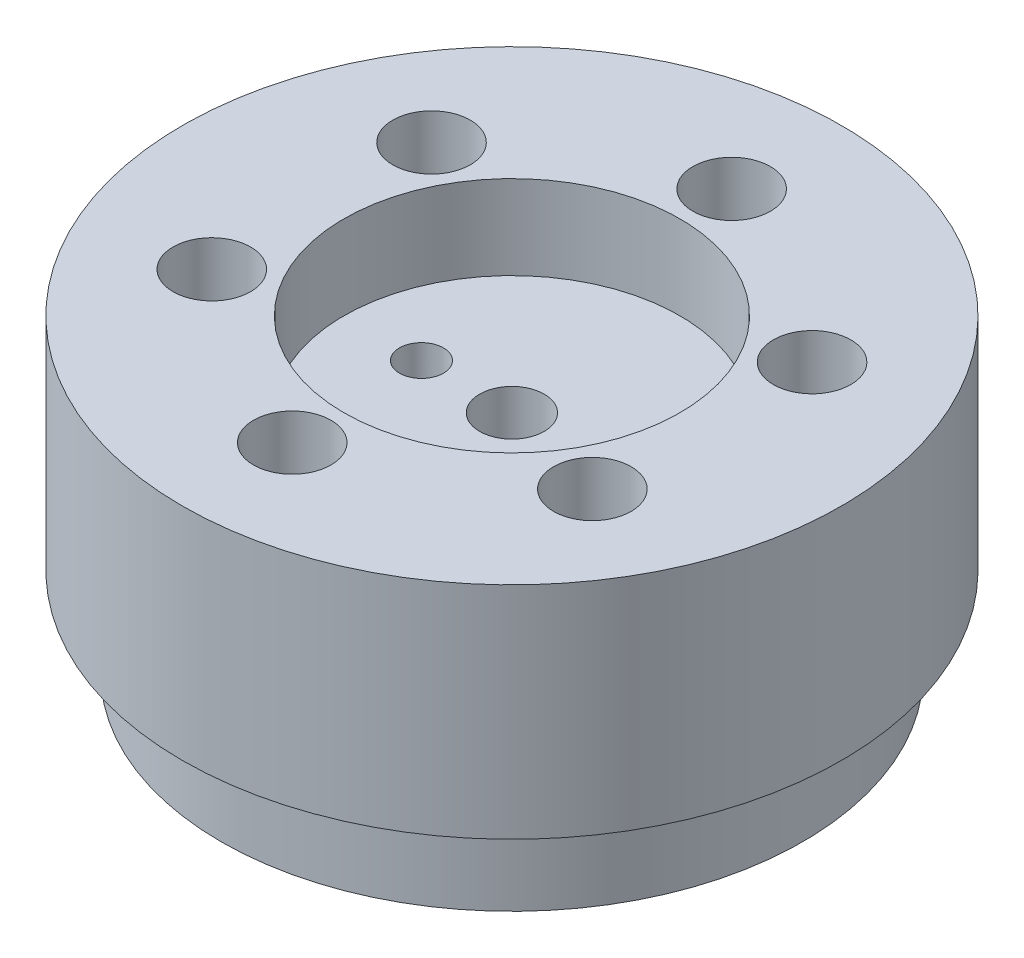
ISO-10303-21;
HEADER;
FILE_DESCRIPTION(('STEP AP214'),'2;1');
FILE_NAME('part.step','',(''),(''),'','','');
FILE_SCHEMA(('AUTOMOTIVE_DESIGN { 1 0 10303 214 1 1 1 1 }'));
ENDSEC;
DATA;
#1=APPLICATION_CONTEXT('core data for automotive mechanical design processes');
#2=APPLICATION_PROTOCOL_DEFINITION('international standard','automotive_design',2000,#1);
#3=PRODUCT_CONTEXT('',#1,'mechanical');
#4=PRODUCT('Part','Part','',(#3));
#5=PRODUCT_RELATED_PRODUCT_CATEGORY('part','',(#4));
#6=PRODUCT_DEFINITION_FORMATION('','',#4);
#7=PRODUCT_DEFINITION_CONTEXT('part definition',#1,'design');
#8=PRODUCT_DEFINITION('design','',#6,#7);
#9=PRODUCT_DEFINITION_SHAPE('','',#8);
#10=(LENGTH_UNIT() NAMED_UNIT(*) SI_UNIT(.MILLI.,.METRE.));
#11=(NAMED_UNIT(*) PLANE_ANGLE_UNIT() SI_UNIT($,.RADIAN.));
#12=(NAMED_UNIT(*) SI_UNIT($,.STERADIAN.) SOLID_ANGLE_UNIT());
#13=UNCERTAINTY_MEASURE_WITH_UNIT(LENGTH_MEASURE(1.E-05),#10,'distance_accuracy_value','');
#14=(GEOMETRIC_REPRESENTATION_CONTEXT(3) GLOBAL_UNCERTAINTY_ASSIGNED_CONTEXT((#13)) GLOBAL_UNIT_ASSIGNED_CONTEXT((#10,
#11,#12)) REPRESENTATION_CONTEXT('',''));
#15=CARTESIAN_POINT('',(0.,0.,0.));
#16=DIRECTION('',(0.,0.,1.));
#17=DIRECTION('',(1.,0.,0.));
#18=AXIS2_PLACEMENT_3D('',#15,#16,#17);
#19=CARTESIAN_POINT('',(0.,20.,0.));
#20=DIRECTION('',(0.,-1.,0.));
#21=DIRECTION('',(0.,0.,-1.));
#22=AXIS2_PLACEMENT_3D('',#19,#20,#21);
#23=CYLINDRICAL_SURFACE('',#22,22.5);
#24=CARTESIAN_POINT('',(0.,0.,0.));
#25=DIRECTION('',(0.,1.,0.));
#26=DIRECTION('',(0.,0.,1.));
#27=AXIS2_PLACEMENT_3D('',#24,#25,#26);
#28=CIRCLE('',#27,22.5);
#29=CARTESIAN_POINT('',(0.,0.,22.5));
#30=VERTEX_POINT('',#29);
#31=EDGE_CURVE('E248',#30,#30,#28,.T.);
#32=ORIENTED_EDGE('',*,*,#31,.T.);
#33=EDGE_LOOP('',(#32));
#34=FACE_BOUND('',#33,.T.);
#35=CARTESIAN_POINT('',(0.,6.95,0.));
#36=DIRECTION('',(0.,1.,0.));
#37=DIRECTION('',(0.,0.,1.));
#38=AXIS2_PLACEMENT_3D('',#35,#36,#37);
#39=CIRCLE('',#38,22.5);
#40=CARTESIAN_POINT('',(0.,6.95,22.5));
#41=VERTEX_POINT('',#40);
#42=EDGE_CURVE('E13',#41,#41,#39,.T.);
#43=ORIENTED_EDGE('',*,*,#42,.F.);
#44=EDGE_LOOP('',(#43));
#45=FACE_BOUND('',#44,.T.);
#46=ADVANCED_FACE('F73',(#34,#45),#23,.T.);
#47=CARTESIAN_POINT('',(-7.,20.,0.));
#48=DIRECTION('',(0.,-1.,0.));
#49=DIRECTION('',(0.,0.,-1.));
#50=AXIS2_PLACEMENT_3D('',#47,#48,#49);
#51=CYLINDRICAL_SURFACE('',#50,1.7);
#52=CARTESIAN_POINT('',(-7.,17.5,0.));
#53=DIRECTION('',(0.,1.,0.));
#54=DIRECTION('',(0.,0.,1.));
#55=AXIS2_PLACEMENT_3D('',#52,#53,#54);
#56=CIRCLE('',#55,1.7);
#57=CARTESIAN_POINT('',(-7.,17.5,1.7));
#58=VERTEX_POINT('',#57);
#59=EDGE_CURVE('E210',#58,#58,#56,.T.);
#60=ORIENTED_EDGE('',*,*,#59,.T.);
#61=EDGE_LOOP('',(#60));
#62=FACE_BOUND('',#61,.T.);
#63=CARTESIAN_POINT('',(-7.,9.,0.));
#64=DIRECTION('',(0.,-1.,0.));
#65=DIRECTION('',(0.,0.,-1.));
#66=AXIS2_PLACEMENT_3D('',#63,#64,#65);
#67=CIRCLE('',#66,1.7);
#68=CARTESIAN_POINT('',(-7.,9.,-1.7));
#69=VERTEX_POINT('',#68);
#70=EDGE_CURVE('E326',#69,#69,#67,.T.);
#71=ORIENTED_EDGE('',*,*,#70,.T.);
#72=EDGE_LOOP('',(#71));
#73=FACE_BOUND('',#72,.T.);
#74=ADVANCED_FACE('F378',(#62,#73),#51,.F.);
#75=CARTESIAN_POINT('',(7.,20.,0.));
#76=DIRECTION('',(0.,-1.,0.));
#77=DIRECTION('',(0.,0.,-1.));
#78=AXIS2_PLACEMENT_3D('',#75,#76,#77);
#79=CYLINDRICAL_SURFACE('',#78,1.7);
#80=CARTESIAN_POINT('',(7.,17.5,0.));
#81=DIRECTION('',(0.,1.,0.));
#82=DIRECTION('',(0.,0.,1.));
#83=AXIS2_PLACEMENT_3D('',#80,#81,#82);
#84=CIRCLE('',#83,1.7);
#85=CARTESIAN_POINT('',(7.,17.5,1.7));
#86=VERTEX_POINT('',#85);
#87=EDGE_CURVE('E209',#86,#86,#84,.T.);
#88=ORIENTED_EDGE('',*,*,#87,.T.);
#89=EDGE_LOOP('',(#88));
#90=FACE_BOUND('',#89,.T.);
#91=CARTESIAN_POINT('',(7.,9.,0.));
#92=DIRECTION('',(0.,-1.,0.));
#93=DIRECTION('',(0.,0.,-1.));
#94=AXIS2_PLACEMENT_3D('',#91,#92,#93);
#95=CIRCLE('',#94,1.7);
#96=CARTESIAN_POINT('',(7.,9.,-1.7));
#97=VERTEX_POINT('',#96);
#98=EDGE_CURVE('E320',#97,#97,#95,.T.);
#99=ORIENTED_EDGE('',*,*,#98,.T.);
#100=EDGE_LOOP('',(#99));
#101=FACE_BOUND('',#100,.T.);
#102=ADVANCED_FACE('F386',(#90,#101),#79,.F.);
#103=CARTESIAN_POINT('',(0.,15.,6.42351922616295));
#104=DIRECTION('',(0.,0.,-1.));
#105=DIRECTION('',(-1.,0.,0.));
#106=AXIS2_PLACEMENT_3D('',#103,#104,#105);
#107=PLANE('',#106);
#108=DIRECTION('',(0.,-1.,0.));
#109=VECTOR('',#108,1.);
#110=CARTESIAN_POINT('',(-8.30214142324873,15.,6.42351922616295));
#111=LINE('',#110,#109);
#112=CARTESIAN_POINT('',(-8.30214142324873,0.,6.42351922616295));
#113=VERTEX_POINT('',#112);
#114=CARTESIAN_POINT('',(-8.30214142324873,5.,6.42351922616295));
#115=VERTEX_POINT('',#114);
#116=EDGE_CURVE('E251',#113,#115,#111,.F.);
#117=ORIENTED_EDGE('',*,*,#116,.T.);
#118=DIRECTION('',(-1.,0.,0.));
#119=VECTOR('',#118,1.);
#120=CARTESIAN_POINT('',(8.30214142324873,5.,6.42351922616295));
#121=LINE('',#120,#119);
#122=CARTESIAN_POINT('',(8.30214142324873,5.,6.42351922616295));
#123=VERTEX_POINT('',#122);
#124=EDGE_CURVE('E88',#123,#115,#121,.T.);
#125=ORIENTED_EDGE('',*,*,#124,.F.);
#126=DIRECTION('',(0.,-1.,0.));
#127=VECTOR('',#126,1.);
#128=CARTESIAN_POINT('',(8.30214142324873,0.,6.42351922616295));
#129=LINE('',#128,#127);
#130=CARTESIAN_POINT('',(8.30214142324873,0.,6.42351922616295));
#131=VERTEX_POINT('',#130);
#132=EDGE_CURVE('E150',#123,#131,#129,.T.);
#133=ORIENTED_EDGE('',*,*,#132,.T.);
#134=DIRECTION('',(1.,0.,0.));
#135=VECTOR('',#134,1.);
#136=CARTESIAN_POINT('',(0.,0.,6.42351922616295));
#137=LINE('',#136,#135);
#138=EDGE_CURVE('E220',#113,#131,#137,.T.);
#139=ORIENTED_EDGE('',*,*,#138,.F.);
#140=EDGE_LOOP('',(#117,#125,#133,#139));
#141=FACE_BOUND('',#140,.T.);
#142=ADVANCED_FACE('F375',(#141),#107,.T.);
#143=CARTESIAN_POINT('',(11.3021414232487,15.,0.));
#144=DIRECTION('',(-1.,0.,0.));
#145=DIRECTION('',(0.,0.,1.));
#146=AXIS2_PLACEMENT_3D('',#143,#144,#145);
#147=PLANE('',#146);
#148=DIRECTION('',(0.,-1.,0.));
#149=VECTOR('',#148,1.);
#150=CARTESIAN_POINT('',(11.3021414232487,15.,3.42351922616295));
#151=LINE('',#150,#149);
#152=CARTESIAN_POINT('',(11.3021414232487,0.,3.42351922616295));
#153=VERTEX_POINT('',#152);
#154=CARTESIAN_POINT('',(11.3021414232487,5.,3.42351922616295));
#155=VERTEX_POINT('',#154);
#156=EDGE_CURVE('E149',#153,#155,#151,.F.);
#157=ORIENTED_EDGE('',*,*,#156,.T.);
#158=DIRECTION('',(0.,0.,1.));
#159=VECTOR('',#158,1.);
#160=CARTESIAN_POINT('',(11.3021414232487,5.,3.42351922616295));
#161=LINE('',#160,#159);
#162=CARTESIAN_POINT('',(11.3021414232487,5.,-3.42351922616295));
#163=VERTEX_POINT('',#162);
#164=EDGE_CURVE('E153',#163,#155,#161,.T.);
#165=ORIENTED_EDGE('',*,*,#164,.F.);
#166=DIRECTION('',(0.,-1.,0.));
#167=VECTOR('',#166,1.);
#168=CARTESIAN_POINT('',(11.3021414232487,15.,-3.42351922616295));
#169=LINE('',#168,#167);
#170=CARTESIAN_POINT('',(11.3021414232487,0.,-3.42351922616295));
#171=VERTEX_POINT('',#170);
#172=EDGE_CURVE('E139',#163,#171,#169,.T.);
#173=ORIENTED_EDGE('',*,*,#172,.T.);
#174=DIRECTION('',(0.,0.,-1.));
#175=VECTOR('',#174,1.);
#176=CARTESIAN_POINT('',(11.3021414232487,0.,0.));
#177=LINE('',#176,#175);
#178=EDGE_CURVE('E225',#153,#171,#177,.T.);
#179=ORIENTED_EDGE('',*,*,#178,.F.);
#180=EDGE_LOOP('',(#157,#165,#173,#179));
#181=FACE_BOUND('',#180,.T.);
#182=ADVANCED_FACE('F154',(#181),#147,.T.);
#183=CARTESIAN_POINT('',(0.,15.,-6.42351922616295));
#184=DIRECTION('',(0.,0.,-1.));
#185=DIRECTION('',(-1.,0.,0.));
#186=AXIS2_PLACEMENT_3D('',#183,#184,#185);
#187=PLANE('',#186);
#188=DIRECTION('',(1.,0.,0.));
#189=VECTOR('',#188,1.);
#190=CARTESIAN_POINT('',(8.30214142324876,5.,-6.42351922616295));
#191=LINE('',#190,#189);
#192=CARTESIAN_POINT('',(-8.30214142324873,5.,-6.42351922616295));
#193=VERTEX_POINT('',#192);
#194=CARTESIAN_POINT('',(8.30214142324873,5.,-6.42351922616295));
#195=VERTEX_POINT('',#194);
#196=EDGE_CURVE('E162',#193,#195,#191,.T.);
#197=ORIENTED_EDGE('',*,*,#196,.F.);
#198=DIRECTION('',(0.,-1.,0.));
#199=VECTOR('',#198,1.);
#200=CARTESIAN_POINT('',(-8.30214142324873,0.,-6.42351922616295));
#201=LINE('',#200,#199);
#202=CARTESIAN_POINT('',(-8.30214142324873,0.,-6.42351922616295));
#203=VERTEX_POINT('',#202);
#204=EDGE_CURVE('E262',#193,#203,#201,.T.);
#205=ORIENTED_EDGE('',*,*,#204,.T.);
#206=DIRECTION('',(1.,0.,0.));
#207=VECTOR('',#206,1.);
#208=CARTESIAN_POINT('',(0.,0.,-6.42351922616295));
#209=LINE('',#208,#207);
#210=CARTESIAN_POINT('',(8.30214142324873,0.,-6.42351922616295));
#211=VERTEX_POINT('',#210);
#212=EDGE_CURVE('E227',#203,#211,#209,.T.);
#213=ORIENTED_EDGE('',*,*,#212,.T.);
#214=DIRECTION('',(0.,-1.,0.));
#215=VECTOR('',#214,1.);
#216=CARTESIAN_POINT('',(8.30214142324873,15.,-6.42351922616295));
#217=LINE('',#216,#215);
#218=EDGE_CURVE('E260',#211,#195,#217,.F.);
#219=ORIENTED_EDGE('',*,*,#218,.T.);
#220=EDGE_LOOP('',(#197,#205,#213,#219));
#221=FACE_BOUND('',#220,.T.);
#222=ADVANCED_FACE('F366',(#221),#187,.F.);
#223=CARTESIAN_POINT('',(-11.3021414232487,15.,0.));
#224=DIRECTION('',(-1.,0.,0.));
#225=DIRECTION('',(0.,0.,1.));
#226=AXIS2_PLACEMENT_3D('',#223,#224,#225);
#227=PLANE('',#226);
#228=DIRECTION('',(0.,0.,-1.));
#229=VECTOR('',#228,1.);
#230=CARTESIAN_POINT('',(-11.3021414232487,5.,-3.42351922616297));
#231=LINE('',#230,#229);
#232=CARTESIAN_POINT('',(-11.3021414232487,5.,3.42351922616295));
#233=VERTEX_POINT('',#232);
#234=CARTESIAN_POINT('',(-11.3021414232487,5.,-3.42351922616295));
#235=VERTEX_POINT('',#234);
#236=EDGE_CURVE('E348',#233,#235,#231,.T.);
#237=ORIENTED_EDGE('',*,*,#236,.F.);
#238=DIRECTION('',(0.,-1.,0.));
#239=VECTOR('',#238,1.);
#240=CARTESIAN_POINT('',(-11.3021414232487,15.,3.42351922616295));
#241=LINE('',#240,#239);
#242=CARTESIAN_POINT('',(-11.3021414232487,0.,3.42351922616295));
#243=VERTEX_POINT('',#242);
#244=EDGE_CURVE('E258',#233,#243,#241,.T.);
#245=ORIENTED_EDGE('',*,*,#244,.T.);
#246=DIRECTION('',(0.,0.,-1.));
#247=VECTOR('',#246,1.);
#248=CARTESIAN_POINT('',(-11.3021414232487,0.,0.));
#249=LINE('',#248,#247);
#250=CARTESIAN_POINT('',(-11.3021414232487,0.,-3.42351922616295));
#251=VERTEX_POINT('',#250);
#252=EDGE_CURVE('E230',#243,#251,#249,.T.);
#253=ORIENTED_EDGE('',*,*,#252,.T.);
#254=DIRECTION('',(0.,-1.,0.));
#255=VECTOR('',#254,1.);
#256=CARTESIAN_POINT('',(-11.3021414232487,15.,-3.42351922616295));
#257=LINE('',#256,#255);
#258=EDGE_CURVE('E255',#251,#235,#257,.F.);
#259=ORIENTED_EDGE('',*,*,#258,.T.);
#260=EDGE_LOOP('',(#237,#245,#253,#259));
#261=FACE_BOUND('',#260,.T.);
#262=ADVANCED_FACE('F356',(#261),#227,.F.);
#263=CARTESIAN_POINT('',(8.30214142324873,15.,3.42351922616295));
#264=DIRECTION('',(0.,1.,0.));
#265=DIRECTION('',(0.,0.,1.));
#266=AXIS2_PLACEMENT_3D('',#263,#264,#265);
#267=CYLINDRICAL_SURFACE('',#266,3.);
#268=CARTESIAN_POINT('',(8.30214142324873,5.,3.42351922616294));
#269=DIRECTION('',(0.,-1.,0.));
#270=DIRECTION('',(0.,0.,1.));
#271=AXIS2_PLACEMENT_3D('',#268,#269,#270);
#272=CIRCLE('',#271,3.00000000000001);
#273=EDGE_CURVE('E95',#155,#123,#272,.T.);
#274=ORIENTED_EDGE('',*,*,#273,.F.);
#275=ORIENTED_EDGE('',*,*,#156,.F.);
#276=CARTESIAN_POINT('',(8.30214142324873,0.,3.42351922616295));
#277=DIRECTION('',(0.,1.,0.));
#278=DIRECTION('',(0.,0.,1.));
#279=AXIS2_PLACEMENT_3D('',#276,#277,#278);
#280=CIRCLE('',#279,3.);
#281=EDGE_CURVE('E264',#131,#153,#280,.T.);
#282=ORIENTED_EDGE('',*,*,#281,.F.);
#283=ORIENTED_EDGE('',*,*,#132,.F.);
#284=EDGE_LOOP('',(#274,#275,#282,#283));
#285=FACE_BOUND('',#284,.T.);
#286=ADVANCED_FACE('F373',(#285),#267,.F.);
#287=CARTESIAN_POINT('',(-8.30214142324873,15.,3.42351922616295));
#288=DIRECTION('',(0.,-1.,0.));
#289=DIRECTION('',(0.,0.,-1.));
#290=AXIS2_PLACEMENT_3D('',#287,#288,#289);
#291=CYLINDRICAL_SURFACE('',#290,3.);
#292=CARTESIAN_POINT('',(-8.30214142324872,5.,3.42351922616295));
#293=DIRECTION('',(0.,-1.,0.));
#294=DIRECTION('',(0.,0.,-1.));
#295=AXIS2_PLACEMENT_3D('',#292,#293,#294);
#296=CIRCLE('',#295,3.00000000000001);
#297=EDGE_CURVE('E345',#115,#233,#296,.T.);
#298=ORIENTED_EDGE('',*,*,#297,.F.);
#299=ORIENTED_EDGE('',*,*,#116,.F.);
#300=CARTESIAN_POINT('',(-8.30214142324873,0.,3.42351922616295));
#301=DIRECTION('',(0.,1.,0.));
#302=DIRECTION('',(0.,0.,1.));
#303=AXIS2_PLACEMENT_3D('',#300,#301,#302);
#304=CIRCLE('',#303,3.);
#305=EDGE_CURVE('E266',#243,#113,#304,.T.);
#306=ORIENTED_EDGE('',*,*,#305,.F.);
#307=ORIENTED_EDGE('',*,*,#244,.F.);
#308=EDGE_LOOP('',(#298,#299,#306,#307));
#309=FACE_BOUND('',#308,.T.);
#310=ADVANCED_FACE('F406',(#309),#291,.F.);
#311=CARTESIAN_POINT('',(-8.30214142324873,15.,-3.42351922616295));
#312=DIRECTION('',(0.,1.,0.));
#313=DIRECTION('',(0.,0.,1.));
#314=AXIS2_PLACEMENT_3D('',#311,#312,#313);
#315=CYLINDRICAL_SURFACE('',#314,3.);
#316=CARTESIAN_POINT('',(-8.30214142324873,5.,-3.42351922616295));
#317=DIRECTION('',(0.,-1.,0.));
#318=DIRECTION('',(0.,0.,-1.));
#319=AXIS2_PLACEMENT_3D('',#316,#317,#318);
#320=CIRCLE('',#319,3.00000000000001);
#321=EDGE_CURVE('E164',#235,#193,#320,.T.);
#322=ORIENTED_EDGE('',*,*,#321,.F.);
#323=ORIENTED_EDGE('',*,*,#258,.F.);
#324=CARTESIAN_POINT('',(-8.30214142324873,0.,-3.42351922616295));
#325=DIRECTION('',(0.,1.,0.));
#326=DIRECTION('',(0.,0.,1.));
#327=AXIS2_PLACEMENT_3D('',#324,#325,#326);
#328=CIRCLE('',#327,3.);
#329=EDGE_CURVE('E268',#203,#251,#328,.T.);
#330=ORIENTED_EDGE('',*,*,#329,.F.);
#331=ORIENTED_EDGE('',*,*,#204,.F.);
#332=EDGE_LOOP('',(#322,#323,#330,#331));
#333=FACE_BOUND('',#332,.T.);
#334=ADVANCED_FACE('F353',(#333),#315,.F.);
#335=CARTESIAN_POINT('',(8.30214142324873,15.,-3.42351922616295));
#336=DIRECTION('',(0.,-1.,0.));
#337=DIRECTION('',(0.,0.,-1.));
#338=AXIS2_PLACEMENT_3D('',#335,#336,#337);
#339=CYLINDRICAL_SURFACE('',#338,3.);
#340=CARTESIAN_POINT('',(8.30214142324873,5.,-3.42351922616295));
#341=DIRECTION('',(0.,-1.,0.));
#342=DIRECTION('',(0.,0.,1.));
#343=AXIS2_PLACEMENT_3D('',#340,#341,#342);
#344=CIRCLE('',#343,3.00000000000001);
#345=EDGE_CURVE('E143',#195,#163,#344,.T.);
#346=ORIENTED_EDGE('',*,*,#345,.F.);
#347=ORIENTED_EDGE('',*,*,#218,.F.);
#348=CARTESIAN_POINT('',(8.30214142324873,0.,-3.42351922616295));
#349=DIRECTION('',(0.,1.,0.));
#350=DIRECTION('',(0.,0.,1.));
#351=AXIS2_PLACEMENT_3D('',#348,#349,#350);
#352=CIRCLE('',#351,3.);
#353=EDGE_CURVE('E145',#171,#211,#352,.T.);
#354=ORIENTED_EDGE('',*,*,#353,.F.);
#355=ORIENTED_EDGE('',*,*,#172,.F.);
#356=EDGE_LOOP('',(#346,#347,#354,#355));
#357=FACE_BOUND('',#356,.T.);
#358=ADVANCED_FACE('F75',(#357),#339,.F.);
#359=CARTESIAN_POINT('',(0.,20.,0.));
#360=DIRECTION('',(0.,-1.,0.));
#361=DIRECTION('',(0.,0.,-1.));
#362=AXIS2_PLACEMENT_3D('',#359,#360,#361);
#363=CYLINDRICAL_SURFACE('',#362,2.5);
#364=CARTESIAN_POINT('',(0.,17.5,0.));
#365=DIRECTION('',(0.,1.,0.));
#366=DIRECTION('',(0.,0.,1.));
#367=AXIS2_PLACEMENT_3D('',#364,#365,#366);
#368=CIRCLE('',#367,2.5);
#369=CARTESIAN_POINT('',(0.,17.5,2.5));
#370=VERTEX_POINT('',#369);
#371=EDGE_CURVE('E213',#370,#370,#368,.T.);
#372=ORIENTED_EDGE('',*,*,#371,.T.);
#373=EDGE_LOOP('',(#372));
#374=FACE_BOUND('',#373,.T.);
#375=CARTESIAN_POINT('',(0.,5.,0.));
#376=DIRECTION('',(0.,-1.,0.));
#377=DIRECTION('',(0.,0.,-1.));
#378=AXIS2_PLACEMENT_3D('',#375,#376,#377);
#379=CIRCLE('',#378,2.5);
#380=CARTESIAN_POINT('',(0.,5.,-2.5));
#381=VERTEX_POINT('',#380);
#382=EDGE_CURVE('E334',#381,#381,#379,.T.);
#383=ORIENTED_EDGE('',*,*,#382,.T.);
#384=EDGE_LOOP('',(#383));
#385=FACE_BOUND('',#384,.T.);
#386=ADVANCED_FACE('F413',(#374,#385),#363,.F.);
#387=CARTESIAN_POINT('',(0.,0.,0.));
#388=DIRECTION('',(0.,1.,0.));
#389=DIRECTION('',(0.,0.,1.));
#390=AXIS2_PLACEMENT_3D('',#387,#388,#389);
#391=PLANE('',#390);
#392=ORIENTED_EDGE('',*,*,#31,.F.);
#393=EDGE_LOOP('',(#392));
#394=FACE_BOUND('',#393,.T.);
#395=ORIENTED_EDGE('',*,*,#252,.F.);
#396=ORIENTED_EDGE('',*,*,#305,.T.);
#397=ORIENTED_EDGE('',*,*,#138,.T.);
#398=ORIENTED_EDGE('',*,*,#281,.T.);
#399=ORIENTED_EDGE('',*,*,#178,.T.);
#400=ORIENTED_EDGE('',*,*,#353,.T.);
#401=ORIENTED_EDGE('',*,*,#212,.F.);
#402=ORIENTED_EDGE('',*,*,#329,.T.);
#403=EDGE_LOOP('',(#395,#396,#397,#398,#399,#400,#401,#402));
#404=FACE_BOUND('',#403,.T.);
#405=CARTESIAN_POINT('',(-14.7224318643355,0.,8.49999999999986));
#406=DIRECTION('',(0.,1.,0.));
#407=DIRECTION('',(0.,0.,1.));
#408=AXIS2_PLACEMENT_3D('',#405,#406,#407);
#409=CIRCLE('',#408,1.7);
#410=CARTESIAN_POINT('',(-14.7224318643355,0.,10.1999999999999));
#411=VERTEX_POINT('',#410);
#412=EDGE_CURVE('E203',#411,#411,#409,.T.);
#413=ORIENTED_EDGE('',*,*,#412,.T.);
#414=EDGE_LOOP('',(#413));
#415=FACE_BOUND('',#414,.T.);
#416=CARTESIAN_POINT('',(-14.7224318643354,0.,-8.50000000000014));
#417=DIRECTION('',(0.,1.,0.));
#418=DIRECTION('',(0.,0.,1.));
#419=AXIS2_PLACEMENT_3D('',#416,#417,#418);
#420=CIRCLE('',#419,1.7);
#421=CARTESIAN_POINT('',(-14.7224318643354,0.,-6.80000000000014));
#422=VERTEX_POINT('',#421);
#423=EDGE_CURVE('E200',#422,#422,#420,.T.);
#424=ORIENTED_EDGE('',*,*,#423,.T.);
#425=EDGE_LOOP('',(#424));
#426=FACE_BOUND('',#425,.T.);
#427=CARTESIAN_POINT('',(14.7224318643355,0.,-8.49999999999987));
#428=DIRECTION('',(0.,1.,0.));
#429=DIRECTION('',(0.,0.,1.));
#430=AXIS2_PLACEMENT_3D('',#427,#428,#429);
#431=CIRCLE('',#430,1.69999999999999);
#432=CARTESIAN_POINT('',(14.7224318643355,0.,-6.79999999999987));
#433=VERTEX_POINT('',#432);
#434=EDGE_CURVE('E197',#433,#433,#431,.T.);
#435=ORIENTED_EDGE('',*,*,#434,.T.);
#436=EDGE_LOOP('',(#435));
#437=FACE_BOUND('',#436,.T.);
#438=CARTESIAN_POINT('',(14.7224318643354,0.,8.50000000000013));
#439=DIRECTION('',(0.,1.,0.));
#440=DIRECTION('',(0.,0.,1.));
#441=AXIS2_PLACEMENT_3D('',#438,#439,#440);
#442=CIRCLE('',#441,1.7);
#443=CARTESIAN_POINT('',(14.7224318643354,0.,10.2000000000001));
#444=VERTEX_POINT('',#443);
#445=EDGE_CURVE('E194',#444,#444,#442,.T.);
#446=ORIENTED_EDGE('',*,*,#445,.T.);
#447=EDGE_LOOP('',(#446));
#448=FACE_BOUND('',#447,.T.);
#449=CARTESIAN_POINT('',(0.,0.,-17.));
#450=DIRECTION('',(0.,1.,0.));
#451=DIRECTION('',(0.,0.,1.));
#452=AXIS2_PLACEMENT_3D('',#449,#450,#451);
#453=CIRCLE('',#452,1.7);
#454=CARTESIAN_POINT('',(0.,0.,-15.3));
#455=VERTEX_POINT('',#454);
#456=EDGE_CURVE('E191',#455,#455,#453,.T.);
#457=ORIENTED_EDGE('',*,*,#456,.T.);
#458=EDGE_LOOP('',(#457));
#459=FACE_BOUND('',#458,.T.);
#460=CARTESIAN_POINT('',(-1.62326980651909E-13,0.,17.));
#461=DIRECTION('',(0.,1.,0.));
#462=DIRECTION('',(0.,0.,1.));
#463=AXIS2_PLACEMENT_3D('',#460,#461,#462);
#464=CIRCLE('',#463,1.7);
#465=CARTESIAN_POINT('',(-1.62326980651909E-13,0.,18.7));
#466=VERTEX_POINT('',#465);
#467=EDGE_CURVE('E188',#466,#466,#464,.T.);
#468=ORIENTED_EDGE('',*,*,#467,.T.);
#469=EDGE_LOOP('',(#468));
#470=FACE_BOUND('',#469,.T.);
#471=ADVANCED_FACE('F361',(#394,#404,#415,#426,#437,#448,#459,#470),#391,.F.);
#472=CARTESIAN_POINT('',(14.7224318643354,20.,8.50000000000013));
#473=DIRECTION('',(0.,-1.,0.));
#474=DIRECTION('',(0.,0.,-1.));
#475=AXIS2_PLACEMENT_3D('',#472,#473,#474);
#476=CYLINDRICAL_SURFACE('',#475,3.);
#477=CARTESIAN_POINT('',(14.7224318643354,12.,8.50000000000013));
#478=DIRECTION('',(0.,1.,0.));
#479=DIRECTION('',(0.,0.,1.));
#480=AXIS2_PLACEMENT_3D('',#477,#478,#479);
#481=CIRCLE('',#480,3.);
#482=CARTESIAN_POINT('',(14.7224318643354,12.,11.5000000000001));
#483=VERTEX_POINT('',#482);
#484=EDGE_CURVE('E282',#483,#483,#481,.T.);
#485=ORIENTED_EDGE('',*,*,#484,.F.);
#486=EDGE_LOOP('',(#485));
#487=FACE_BOUND('',#486,.T.);
#488=CARTESIAN_POINT('',(14.7224318643354,24.,8.50000000000013));
#489=DIRECTION('',(0.,1.,0.));
#490=DIRECTION('',(0.,0.,1.));
#491=AXIS2_PLACEMENT_3D('',#488,#489,#490);
#492=CIRCLE('',#491,3.);
#493=CARTESIAN_POINT('',(14.7224318643354,24.,11.5000000000001));
#494=VERTEX_POINT('',#493);
#495=EDGE_CURVE('E233',#494,#494,#492,.T.);
#496=ORIENTED_EDGE('',*,*,#495,.T.);
#497=EDGE_LOOP('',(#496));
#498=FACE_BOUND('',#497,.T.);
#499=ADVANCED_FACE('F399',(#487,#498),#476,.F.);
#500=CARTESIAN_POINT('',(14.7224318643355,20.,-8.49999999999987));
#501=DIRECTION('',(0.,-1.,0.));
#502=DIRECTION('',(0.,0.,-1.));
#503=AXIS2_PLACEMENT_3D('',#500,#501,#502);
#504=CYLINDRICAL_SURFACE('',#503,3.);
#505=CARTESIAN_POINT('',(14.7224318643355,12.,-8.49999999999987));
#506=DIRECTION('',(0.,1.,0.));
#507=DIRECTION('',(0.,0.,1.));
#508=AXIS2_PLACEMENT_3D('',#505,#506,#507);
#509=CIRCLE('',#508,3.);
#510=CARTESIAN_POINT('',(14.7224318643355,12.,-5.49999999999987));
#511=VERTEX_POINT('',#510);
#512=EDGE_CURVE('E279',#511,#511,#509,.T.);
#513=ORIENTED_EDGE('',*,*,#512,.F.);
#514=EDGE_LOOP('',(#513));
#515=FACE_BOUND('',#514,.T.);
#516=CARTESIAN_POINT('',(14.7224318643355,24.,-8.49999999999987));
#517=DIRECTION('',(0.,1.,0.));
#518=DIRECTION('',(0.,0.,1.));
#519=AXIS2_PLACEMENT_3D('',#516,#517,#518);
#520=CIRCLE('',#519,3.);
#521=CARTESIAN_POINT('',(14.7224318643355,24.,-5.49999999999987));
#522=VERTEX_POINT('',#521);
#523=EDGE_CURVE('E236',#522,#522,#520,.T.);
#524=ORIENTED_EDGE('',*,*,#523,.T.);
#525=EDGE_LOOP('',(#524));
#526=FACE_BOUND('',#525,.T.);
#527=ADVANCED_FACE('F395',(#515,#526),#504,.F.);
#528=CARTESIAN_POINT('',(-14.7224318643354,20.,-8.50000000000014));
#529=DIRECTION('',(0.,-1.,0.));
#530=DIRECTION('',(0.,0.,-1.));
#531=AXIS2_PLACEMENT_3D('',#528,#529,#530);
#532=CYLINDRICAL_SURFACE('',#531,3.);
#533=CARTESIAN_POINT('',(-14.7224318643354,12.,-8.50000000000014));
#534=DIRECTION('',(0.,1.,0.));
#535=DIRECTION('',(0.,0.,1.));
#536=AXIS2_PLACEMENT_3D('',#533,#534,#535);
#537=CIRCLE('',#536,3.);
#538=CARTESIAN_POINT('',(-14.7224318643354,12.,-5.50000000000014));
#539=VERTEX_POINT('',#538);
#540=EDGE_CURVE('E271',#539,#539,#537,.T.);
#541=ORIENTED_EDGE('',*,*,#540,.F.);
#542=EDGE_LOOP('',(#541));
#543=FACE_BOUND('',#542,.T.);
#544=CARTESIAN_POINT('',(-14.7224318643354,24.,-8.50000000000014));
#545=DIRECTION('',(0.,1.,0.));
#546=DIRECTION('',(0.,0.,1.));
#547=AXIS2_PLACEMENT_3D('',#544,#545,#546);
#548=CIRCLE('',#547,3.);
#549=CARTESIAN_POINT('',(-14.7224318643354,24.,-5.50000000000014));
#550=VERTEX_POINT('',#549);
#551=EDGE_CURVE('E239',#550,#550,#548,.T.);
#552=ORIENTED_EDGE('',*,*,#551,.T.);
#553=EDGE_LOOP('',(#552));
#554=FACE_BOUND('',#553,.T.);
#555=ADVANCED_FACE('F296',(#543,#554),#532,.F.);
#556=CARTESIAN_POINT('',(-14.7224318643355,20.,8.49999999999986));
#557=DIRECTION('',(0.,-1.,0.));
#558=DIRECTION('',(0.,0.,-1.));
#559=AXIS2_PLACEMENT_3D('',#556,#557,#558);
#560=CYLINDRICAL_SURFACE('',#559,3.);
#561=CARTESIAN_POINT('',(-14.7224318643355,12.,8.49999999999986));
#562=DIRECTION('',(0.,1.,0.));
#563=DIRECTION('',(0.,0.,1.));
#564=AXIS2_PLACEMENT_3D('',#561,#562,#563);
#565=CIRCLE('',#564,3.);
#566=CARTESIAN_POINT('',(-14.7224318643355,12.,11.4999999999999));
#567=VERTEX_POINT('',#566);
#568=EDGE_CURVE('E81',#567,#567,#565,.T.);
#569=ORIENTED_EDGE('',*,*,#568,.F.);
#570=EDGE_LOOP('',(#569));
#571=FACE_BOUND('',#570,.T.);
#572=CARTESIAN_POINT('',(-14.7224318643355,24.,8.49999999999986));
#573=DIRECTION('',(0.,1.,0.));
#574=DIRECTION('',(0.,0.,1.));
#575=AXIS2_PLACEMENT_3D('',#572,#573,#574);
#576=CIRCLE('',#575,3.);
#577=CARTESIAN_POINT('',(-14.7224318643355,24.,11.4999999999999));
#578=VERTEX_POINT('',#577);
#579=EDGE_CURVE('E242',#578,#578,#576,.T.);
#580=ORIENTED_EDGE('',*,*,#579,.T.);
#581=EDGE_LOOP('',(#580));
#582=FACE_BOUND('',#581,.T.);
#583=ADVANCED_FACE('F292',(#571,#582),#560,.F.);
#584=CARTESIAN_POINT('',(0.,24.,0.));
#585=DIRECTION('',(0.,-1.,0.));
#586=DIRECTION('',(0.,0.,-1.));
#587=AXIS2_PLACEMENT_3D('',#584,#585,#586);
#588=CYLINDRICAL_SURFACE('',#587,13.);
#589=CARTESIAN_POINT('',(0.,24.,0.));
#590=DIRECTION('',(0.,1.,0.));
#591=DIRECTION('',(0.,0.,1.));
#592=AXIS2_PLACEMENT_3D('',#589,#590,#591);
#593=CIRCLE('',#592,13.);
#594=CARTESIAN_POINT('',(0.,24.,13.));
#595=VERTEX_POINT('',#594);
#596=EDGE_CURVE('E245',#595,#595,#593,.T.);
#597=ORIENTED_EDGE('',*,*,#596,.T.);
#598=EDGE_LOOP('',(#597));
#599=FACE_BOUND('',#598,.T.);
#600=CARTESIAN_POINT('',(0.,17.5,0.));
#601=DIRECTION('',(0.,1.,0.));
#602=DIRECTION('',(0.,0.,1.));
#603=AXIS2_PLACEMENT_3D('',#600,#601,#602);
#604=CIRCLE('',#603,13.);
#605=CARTESIAN_POINT('',(0.,17.5,13.));
#606=VERTEX_POINT('',#605);
#607=EDGE_CURVE('E206',#606,#606,#604,.T.);
#608=ORIENTED_EDGE('',*,*,#607,.F.);
#609=EDGE_LOOP('',(#608));
#610=FACE_BOUND('',#609,.T.);
#611=ADVANCED_FACE('F295',(#599,#610),#588,.F.);
#612=CARTESIAN_POINT('',(0.,24.,0.));
#613=DIRECTION('',(0.,1.,0.));
#614=DIRECTION('',(0.,0.,1.));
#615=AXIS2_PLACEMENT_3D('',#612,#613,#614);
#616=PLANE('',#615);
#617=CARTESIAN_POINT('',(0.,24.,-17.));
#618=DIRECTION('',(0.,1.,0.));
#619=DIRECTION('',(0.,0.,1.));
#620=AXIS2_PLACEMENT_3D('',#617,#618,#619);
#621=CIRCLE('',#620,3.);
#622=CARTESIAN_POINT('',(0.,24.,-14.));
#623=VERTEX_POINT('',#622);
#624=EDGE_CURVE('E217',#623,#623,#621,.T.);
#625=ORIENTED_EDGE('',*,*,#624,.F.);
#626=EDGE_LOOP('',(#625));
#627=FACE_BOUND('',#626,.T.);
#628=CARTESIAN_POINT('',(-1.62326980651909E-13,24.,17.));
#629=DIRECTION('',(0.,1.,0.));
#630=DIRECTION('',(0.,0.,1.));
#631=AXIS2_PLACEMENT_3D('',#628,#629,#630);
#632=CIRCLE('',#631,3.);
#633=CARTESIAN_POINT('',(-1.62326980651909E-13,24.,20.));
#634=VERTEX_POINT('',#633);
#635=EDGE_CURVE('E216',#634,#634,#632,.T.);
#636=ORIENTED_EDGE('',*,*,#635,.F.);
#637=EDGE_LOOP('',(#636));
#638=FACE_BOUND('',#637,.T.);
#639=ORIENTED_EDGE('',*,*,#495,.F.);
#640=EDGE_LOOP('',(#639));
#641=FACE_BOUND('',#640,.T.);
#642=ORIENTED_EDGE('',*,*,#523,.F.);
#643=EDGE_LOOP('',(#642));
#644=FACE_BOUND('',#643,.T.);
#645=ORIENTED_EDGE('',*,*,#551,.F.);
#646=EDGE_LOOP('',(#645));
#647=FACE_BOUND('',#646,.T.);
#648=ORIENTED_EDGE('',*,*,#579,.F.);
#649=EDGE_LOOP('',(#648));
#650=FACE_BOUND('',#649,.T.);
#651=ORIENTED_EDGE('',*,*,#596,.F.);
#652=EDGE_LOOP('',(#651));
#653=FACE_BOUND('',#652,.T.);
#654=CARTESIAN_POINT('',(0.,24.,0.));
#655=DIRECTION('',(0.,1.,0.));
#656=DIRECTION('',(0.,0.,1.));
#657=AXIS2_PLACEMENT_3D('',#654,#655,#656);
#658=CIRCLE('',#657,25.5);
#659=CARTESIAN_POINT('',(0.,24.,25.5));
#660=VERTEX_POINT('',#659);
#661=EDGE_CURVE('E185',#660,#660,#658,.T.);
#662=ORIENTED_EDGE('',*,*,#661,.T.);
#663=EDGE_LOOP('',(#662));
#664=FACE_BOUND('',#663,.T.);
#665=ADVANCED_FACE('F300',(#627,#638,#641,#644,#647,#650,#653,#664),#616,.T.);
#666=CARTESIAN_POINT('',(-1.62326980651909E-13,32.4852813742386,17.));
#667=DIRECTION('',(0.,-1.,0.));
#668=DIRECTION('',(0.,0.,-1.));
#669=AXIS2_PLACEMENT_3D('',#666,#667,#668);
#670=CYLINDRICAL_SURFACE('',#669,3.);
#671=CARTESIAN_POINT('',(-1.62326980651909E-13,12.,17.));
#672=DIRECTION('',(0.,1.,0.));
#673=DIRECTION('',(0.,0.,1.));
#674=AXIS2_PLACEMENT_3D('',#671,#672,#673);
#675=CIRCLE('',#674,3.);
#676=CARTESIAN_POINT('',(-1.62326980651909E-13,12.,20.));
#677=VERTEX_POINT('',#676);
#678=EDGE_CURVE('E285',#677,#677,#675,.T.);
#679=ORIENTED_EDGE('',*,*,#678,.F.);
#680=EDGE_LOOP('',(#679));
#681=FACE_BOUND('',#680,.T.);
#682=ORIENTED_EDGE('',*,*,#635,.T.);
#683=EDGE_LOOP('',(#682));
#684=FACE_BOUND('',#683,.T.);
#685=ADVANCED_FACE('F303',(#681,#684),#670,.F.);
#686=CARTESIAN_POINT('',(0.,32.4852813742386,-17.));
#687=DIRECTION('',(0.,-1.,0.));
#688=DIRECTION('',(0.,0.,-1.));
#689=AXIS2_PLACEMENT_3D('',#686,#687,#688);
#690=CYLINDRICAL_SURFACE('',#689,3.);
#691=CARTESIAN_POINT('',(0.,12.,-17.));
#692=DIRECTION('',(0.,1.,0.));
#693=DIRECTION('',(0.,0.,1.));
#694=AXIS2_PLACEMENT_3D('',#691,#692,#693);
#695=CIRCLE('',#694,3.);
#696=CARTESIAN_POINT('',(0.,12.,-14.));
#697=VERTEX_POINT('',#696);
#698=EDGE_CURVE('E276',#697,#697,#695,.T.);
#699=ORIENTED_EDGE('',*,*,#698,.F.);
#700=EDGE_LOOP('',(#699));
#701=FACE_BOUND('',#700,.T.);
#702=ORIENTED_EDGE('',*,*,#624,.T.);
#703=EDGE_LOOP('',(#702));
#704=FACE_BOUND('',#703,.T.);
#705=ADVANCED_FACE('F438',(#701,#704),#690,.F.);
#706=CARTESIAN_POINT('',(0.,17.5,0.));
#707=DIRECTION('',(0.,1.,0.));
#708=DIRECTION('',(0.,0.,1.));
#709=AXIS2_PLACEMENT_3D('',#706,#707,#708);
#710=PLANE('',#709);
#711=ORIENTED_EDGE('',*,*,#371,.F.);
#712=EDGE_LOOP('',(#711));
#713=FACE_BOUND('',#712,.T.);
#714=ORIENTED_EDGE('',*,*,#59,.F.);
#715=EDGE_LOOP('',(#714));
#716=FACE_BOUND('',#715,.T.);
#717=ORIENTED_EDGE('',*,*,#87,.F.);
#718=EDGE_LOOP('',(#717));
#719=FACE_BOUND('',#718,.T.);
#720=ORIENTED_EDGE('',*,*,#607,.T.);
#721=EDGE_LOOP('',(#720));
#722=FACE_BOUND('',#721,.T.);
#723=ADVANCED_FACE('F435',(#713,#716,#719,#722),#710,.T.);
#724=CARTESIAN_POINT('',(-14.7224318643355,32.4852813742386,8.49999999999986));
#725=DIRECTION('',(0.,-1.,0.));
#726=DIRECTION('',(0.,0.,-1.));
#727=AXIS2_PLACEMENT_3D('',#724,#725,#726);
#728=CYLINDRICAL_SURFACE('',#727,1.7);
#729=ORIENTED_EDGE('',*,*,#412,.F.);
#730=EDGE_LOOP('',(#729));
#731=FACE_BOUND('',#730,.T.);
#732=CARTESIAN_POINT('',(-14.7224318643355,12.,8.49999999999988));
#733=DIRECTION('',(0.,1.,0.));
#734=DIRECTION('',(0.,0.,1.));
#735=AXIS2_PLACEMENT_3D('',#732,#733,#734);
#736=CIRCLE('',#735,1.7);
#737=CARTESIAN_POINT('',(-14.7224318643355,12.,10.1999999999999));
#738=VERTEX_POINT('',#737);
#739=EDGE_CURVE('E156',#738,#738,#736,.T.);
#740=ORIENTED_EDGE('',*,*,#739,.T.);
#741=EDGE_LOOP('',(#740));
#742=FACE_BOUND('',#741,.T.);
#743=ADVANCED_FACE('F437',(#731,#742),#728,.F.);
#744=CARTESIAN_POINT('',(-14.7224318643354,32.4852813742386,-8.50000000000014));
#745=DIRECTION('',(0.,-1.,0.));
#746=DIRECTION('',(0.,0.,-1.));
#747=AXIS2_PLACEMENT_3D('',#744,#745,#746);
#748=CYLINDRICAL_SURFACE('',#747,1.7);
#749=ORIENTED_EDGE('',*,*,#423,.F.);
#750=EDGE_LOOP('',(#749));
#751=FACE_BOUND('',#750,.T.);
#752=CARTESIAN_POINT('',(-14.7224318643354,12.,-8.50000000000012));
#753=DIRECTION('',(0.,1.,0.));
#754=DIRECTION('',(0.,0.,1.));
#755=AXIS2_PLACEMENT_3D('',#752,#753,#754);
#756=CIRCLE('',#755,1.7);
#757=CARTESIAN_POINT('',(-14.7224318643354,12.,-6.80000000000012));
#758=VERTEX_POINT('',#757);
#759=EDGE_CURVE('E182',#758,#758,#756,.T.);
#760=ORIENTED_EDGE('',*,*,#759,.T.);
#761=EDGE_LOOP('',(#760));
#762=FACE_BOUND('',#761,.T.);
#763=ADVANCED_FACE('F445',(#751,#762),#748,.F.);
#764=CARTESIAN_POINT('',(14.7224318643355,32.4852813742386,-8.49999999999987));
#765=DIRECTION('',(0.,-1.,0.));
#766=DIRECTION('',(0.,0.,-1.));
#767=AXIS2_PLACEMENT_3D('',#764,#765,#766);
#768=CYLINDRICAL_SURFACE('',#767,1.69999999999999);
#769=ORIENTED_EDGE('',*,*,#434,.F.);
#770=EDGE_LOOP('',(#769));
#771=FACE_BOUND('',#770,.T.);
#772=CARTESIAN_POINT('',(14.7224318643355,12.,-8.49999999999987));
#773=DIRECTION('',(0.,1.,0.));
#774=DIRECTION('',(0.,0.,1.));
#775=AXIS2_PLACEMENT_3D('',#772,#773,#774);
#776=CIRCLE('',#775,1.69999999999999);
#777=CARTESIAN_POINT('',(14.7224318643355,12.,-6.79999999999987));
#778=VERTEX_POINT('',#777);
#779=EDGE_CURVE('E176',#778,#778,#776,.F.);
#780=ORIENTED_EDGE('',*,*,#779,.F.);
#781=EDGE_LOOP('',(#780));
#782=FACE_BOUND('',#781,.T.);
#783=ADVANCED_FACE('F509',(#771,#782),#768,.F.);
#784=CARTESIAN_POINT('',(14.7224318643354,32.4852813742386,8.50000000000013));
#785=DIRECTION('',(0.,-1.,0.));
#786=DIRECTION('',(0.,0.,-1.));
#787=AXIS2_PLACEMENT_3D('',#784,#785,#786);
#788=CYLINDRICAL_SURFACE('',#787,1.7);
#789=ORIENTED_EDGE('',*,*,#445,.F.);
#790=EDGE_LOOP('',(#789));
#791=FACE_BOUND('',#790,.T.);
#792=CARTESIAN_POINT('',(14.7224318643354,12.,8.50000000000013));
#793=DIRECTION('',(0.,1.,0.));
#794=DIRECTION('',(0.,0.,1.));
#795=AXIS2_PLACEMENT_3D('',#792,#793,#794);
#796=CIRCLE('',#795,1.70000000000001);
#797=CARTESIAN_POINT('',(14.7224318643354,12.,10.2000000000001));
#798=VERTEX_POINT('',#797);
#799=EDGE_CURVE('E173',#798,#798,#796,.T.);
#800=ORIENTED_EDGE('',*,*,#799,.T.);
#801=EDGE_LOOP('',(#800));
#802=FACE_BOUND('',#801,.T.);
#803=ADVANCED_FACE('F505',(#791,#802),#788,.F.);
#804=CARTESIAN_POINT('',(0.,32.4852813742386,-17.));
#805=DIRECTION('',(0.,-1.,0.));
#806=DIRECTION('',(0.,0.,-1.));
#807=AXIS2_PLACEMENT_3D('',#804,#805,#806);
#808=CYLINDRICAL_SURFACE('',#807,1.7);
#809=ORIENTED_EDGE('',*,*,#456,.F.);
#810=EDGE_LOOP('',(#809));
#811=FACE_BOUND('',#810,.T.);
#812=CARTESIAN_POINT('',(1.37476835471162E-13,12.,-17.));
#813=DIRECTION('',(0.,1.,0.));
#814=DIRECTION('',(0.,0.,1.));
#815=AXIS2_PLACEMENT_3D('',#812,#813,#814);
#816=CIRCLE('',#815,1.7);
#817=CARTESIAN_POINT('',(1.37476835471162E-13,12.,-15.3));
#818=VERTEX_POINT('',#817);
#819=EDGE_CURVE('E179',#818,#818,#816,.T.);
#820=ORIENTED_EDGE('',*,*,#819,.T.);
#821=EDGE_LOOP('',(#820));
#822=FACE_BOUND('',#821,.T.);
#823=ADVANCED_FACE('F501',(#811,#822),#808,.F.);
#824=CARTESIAN_POINT('',(-1.62326980651909E-13,32.4852813742386,17.));
#825=DIRECTION('',(0.,-1.,0.));
#826=DIRECTION('',(0.,0.,-1.));
#827=AXIS2_PLACEMENT_3D('',#824,#825,#826);
#828=CYLINDRICAL_SURFACE('',#827,1.7);
#829=ORIENTED_EDGE('',*,*,#467,.F.);
#830=EDGE_LOOP('',(#829));
#831=FACE_BOUND('',#830,.T.);
#832=CARTESIAN_POINT('',(-1.46855184263162E-13,12.,17.));
#833=DIRECTION('',(0.,1.,0.));
#834=DIRECTION('',(0.,0.,1.));
#835=AXIS2_PLACEMENT_3D('',#832,#833,#834);
#836=CIRCLE('',#835,1.7);
#837=CARTESIAN_POINT('',(-1.46855184263162E-13,12.,18.7));
#838=VERTEX_POINT('',#837);
#839=EDGE_CURVE('E170',#838,#838,#836,.T.);
#840=ORIENTED_EDGE('',*,*,#839,.T.);
#841=EDGE_LOOP('',(#840));
#842=FACE_BOUND('',#841,.T.);
#843=ADVANCED_FACE('F314',(#831,#842),#828,.F.);
#844=CARTESIAN_POINT('',(0.,-72.1248916810278,0.));
#845=DIRECTION('',(0.,1.,0.));
#846=DIRECTION('',(0.,0.,1.));
#847=AXIS2_PLACEMENT_3D('',#844,#845,#846);
#848=CYLINDRICAL_SURFACE('',#847,25.5);
#849=ORIENTED_EDGE('',*,*,#661,.F.);
#850=EDGE_LOOP('',(#849));
#851=FACE_BOUND('',#850,.T.);
#852=CARTESIAN_POINT('',(0.,6.95,0.));
#853=DIRECTION('',(0.,1.,0.));
#854=DIRECTION('',(0.,0.,1.));
#855=AXIS2_PLACEMENT_3D('',#852,#853,#854);
#856=CIRCLE('',#855,25.5);
#857=CARTESIAN_POINT('',(0.,6.95,25.5));
#858=VERTEX_POINT('',#857);
#859=EDGE_CURVE('E318',#858,#858,#856,.T.);
#860=ORIENTED_EDGE('',*,*,#859,.T.);
#861=EDGE_LOOP('',(#860));
#862=FACE_BOUND('',#861,.T.);
#863=ADVANCED_FACE('F310',(#851,#862),#848,.T.);
#864=CARTESIAN_POINT('',(0.,12.,0.));
#865=DIRECTION('',(0.,1.,0.));
#866=DIRECTION('',(0.,0.,1.));
#867=AXIS2_PLACEMENT_3D('',#864,#865,#866);
#868=PLANE('',#867);
#869=ORIENTED_EDGE('',*,*,#540,.T.);
#870=EDGE_LOOP('',(#869));
#871=FACE_BOUND('',#870,.T.);
#872=ORIENTED_EDGE('',*,*,#759,.F.);
#873=EDGE_LOOP('',(#872));
#874=FACE_BOUND('',#873,.T.);
#875=ADVANCED_FACE('F313',(#871,#874),#868,.T.);
#876=CARTESIAN_POINT('',(0.,12.,0.));
#877=DIRECTION('',(0.,1.,0.));
#878=DIRECTION('',(0.,0.,1.));
#879=AXIS2_PLACEMENT_3D('',#876,#877,#878);
#880=PLANE('',#879);
#881=ORIENTED_EDGE('',*,*,#819,.F.);
#882=EDGE_LOOP('',(#881));
#883=FACE_BOUND('',#882,.T.);
#884=ORIENTED_EDGE('',*,*,#698,.T.);
#885=EDGE_LOOP('',(#884));
#886=FACE_BOUND('',#885,.T.);
#887=ADVANCED_FACE('F491',(#883,#886),#880,.T.);
#888=CARTESIAN_POINT('',(0.,12.,0.));
#889=DIRECTION('',(0.,1.,0.));
#890=DIRECTION('',(0.,0.,1.));
#891=AXIS2_PLACEMENT_3D('',#888,#889,#890);
#892=PLANE('',#891);
#893=ORIENTED_EDGE('',*,*,#779,.T.);
#894=EDGE_LOOP('',(#893));
#895=FACE_BOUND('',#894,.T.);
#896=ORIENTED_EDGE('',*,*,#512,.T.);
#897=EDGE_LOOP('',(#896));
#898=FACE_BOUND('',#897,.T.);
#899=ADVANCED_FACE('F483',(#895,#898),#892,.T.);
#900=CARTESIAN_POINT('',(0.,12.,0.));
#901=DIRECTION('',(0.,1.,0.));
#902=DIRECTION('',(0.,0.,1.));
#903=AXIS2_PLACEMENT_3D('',#900,#901,#902);
#904=PLANE('',#903);
#905=ORIENTED_EDGE('',*,*,#799,.F.);
#906=EDGE_LOOP('',(#905));
#907=FACE_BOUND('',#906,.T.);
#908=ORIENTED_EDGE('',*,*,#484,.T.);
#909=EDGE_LOOP('',(#908));
#910=FACE_BOUND('',#909,.T.);
#911=ADVANCED_FACE('F474',(#907,#910),#904,.T.);
#912=CARTESIAN_POINT('',(0.,12.,0.));
#913=DIRECTION('',(0.,1.,0.));
#914=DIRECTION('',(0.,0.,1.));
#915=AXIS2_PLACEMENT_3D('',#912,#913,#914);
#916=PLANE('',#915);
#917=ORIENTED_EDGE('',*,*,#839,.F.);
#918=EDGE_LOOP('',(#917));
#919=FACE_BOUND('',#918,.T.);
#920=ORIENTED_EDGE('',*,*,#678,.T.);
#921=EDGE_LOOP('',(#920));
#922=FACE_BOUND('',#921,.T.);
#923=ADVANCED_FACE('F472',(#919,#922),#916,.T.);
#924=CARTESIAN_POINT('',(0.,12.,0.));
#925=DIRECTION('',(0.,1.,0.));
#926=DIRECTION('',(0.,0.,1.));
#927=AXIS2_PLACEMENT_3D('',#924,#925,#926);
#928=PLANE('',#927);
#929=ORIENTED_EDGE('',*,*,#739,.F.);
#930=EDGE_LOOP('',(#929));
#931=FACE_BOUND('',#930,.T.);
#932=ORIENTED_EDGE('',*,*,#568,.T.);
#933=EDGE_LOOP('',(#932));
#934=FACE_BOUND('',#933,.T.);
#935=ADVANCED_FACE('F290',(#931,#934),#928,.T.);
#936=CARTESIAN_POINT('',(8.30214142324873,5.,3.42351922616294));
#937=DIRECTION('',(0.,1.,0.));
#938=DIRECTION('',(0.,0.,1.));
#939=AXIS2_PLACEMENT_3D('',#936,#937,#938);
#940=PLANE('',#939);
#941=CARTESIAN_POINT('',(-7.,5.,0.));
#942=DIRECTION('',(0.,-1.,0.));
#943=DIRECTION('',(0.,0.,-1.));
#944=AXIS2_PLACEMENT_3D('',#941,#942,#943);
#945=CIRCLE('',#944,2.5);
#946=CARTESIAN_POINT('',(-7.,5.,-2.5));
#947=VERTEX_POINT('',#946);
#948=EDGE_CURVE('E329',#947,#947,#945,.T.);
#949=ORIENTED_EDGE('',*,*,#948,.F.);
#950=EDGE_LOOP('',(#949));
#951=FACE_BOUND('',#950,.T.);
#952=CARTESIAN_POINT('',(7.,5.,0.));
#953=DIRECTION('',(0.,-1.,0.));
#954=DIRECTION('',(0.,0.,-1.));
#955=AXIS2_PLACEMENT_3D('',#952,#953,#954);
#956=CIRCLE('',#955,2.5);
#957=CARTESIAN_POINT('',(7.,5.,-2.5));
#958=VERTEX_POINT('',#957);
#959=EDGE_CURVE('E323',#958,#958,#956,.T.);
#960=ORIENTED_EDGE('',*,*,#959,.F.);
#961=EDGE_LOOP('',(#960));
#962=FACE_BOUND('',#961,.T.);
#963=ORIENTED_EDGE('',*,*,#273,.T.);
#964=ORIENTED_EDGE('',*,*,#124,.T.);
#965=ORIENTED_EDGE('',*,*,#297,.T.);
#966=ORIENTED_EDGE('',*,*,#236,.T.);
#967=ORIENTED_EDGE('',*,*,#321,.T.);
#968=ORIENTED_EDGE('',*,*,#196,.T.);
#969=ORIENTED_EDGE('',*,*,#345,.T.);
#970=ORIENTED_EDGE('',*,*,#164,.T.);
#971=EDGE_LOOP('',(#963,#964,#965,#966,#967,#968,#969,#970));
#972=FACE_BOUND('',#971,.T.);
#973=ORIENTED_EDGE('',*,*,#382,.F.);
#974=EDGE_LOOP('',(#973));
#975=FACE_BOUND('',#974,.T.);
#976=ADVANCED_FACE('F159',(#951,#962,#972,#975),#940,.F.);
#977=CARTESIAN_POINT('',(7.,9.,0.));
#978=DIRECTION('',(0.,-1.,0.));
#979=DIRECTION('',(0.,0.,-1.));
#980=AXIS2_PLACEMENT_3D('',#977,#978,#979);
#981=CYLINDRICAL_SURFACE('',#980,2.5);
#982=CARTESIAN_POINT('',(7.,9.,0.));
#983=DIRECTION('',(0.,-1.,0.));
#984=DIRECTION('',(0.,0.,-1.));
#985=AXIS2_PLACEMENT_3D('',#982,#983,#984);
#986=CIRCLE('',#985,2.5);
#987=CARTESIAN_POINT('',(7.,9.,-2.5));
#988=VERTEX_POINT('',#987);
#989=EDGE_CURVE('E330',#988,#988,#986,.T.);
#990=ORIENTED_EDGE('',*,*,#989,.F.);
#991=EDGE_LOOP('',(#990));
#992=FACE_BOUND('',#991,.T.);
#993=ORIENTED_EDGE('',*,*,#959,.T.);
#994=EDGE_LOOP('',(#993));
#995=FACE_BOUND('',#994,.T.);
#996=ADVANCED_FACE('F665',(#992,#995),#981,.F.);
#997=CARTESIAN_POINT('',(7.,9.,0.));
#998=DIRECTION('',(0.,-1.,0.));
#999=DIRECTION('',(0.,0.,-1.));
#1000=AXIS2_PLACEMENT_3D('',#997,#998,#999);
#1001=PLANE('',#1000);
#1002=ORIENTED_EDGE('',*,*,#98,.F.);
#1003=EDGE_LOOP('',(#1002));
#1004=FACE_BOUND('',#1003,.T.);
#1005=ORIENTED_EDGE('',*,*,#989,.T.);
#1006=EDGE_LOOP('',(#1005));
#1007=FACE_BOUND('',#1006,.T.);
#1008=ADVANCED_FACE('F673',(#1004,#1007),#1001,.T.);
#1009=CARTESIAN_POINT('',(-7.,9.,0.));
#1010=DIRECTION('',(0.,-1.,0.));
#1011=DIRECTION('',(0.,0.,-1.));
#1012=AXIS2_PLACEMENT_3D('',#1009,#1010,#1011);
#1013=CYLINDRICAL_SURFACE('',#1012,2.5);
#1014=CARTESIAN_POINT('',(-7.,9.,0.));
#1015=DIRECTION('',(0.,-1.,0.));
#1016=DIRECTION('',(0.,0.,-1.));
#1017=AXIS2_PLACEMENT_3D('',#1014,#1015,#1016);
#1018=CIRCLE('',#1017,2.5);
#1019=CARTESIAN_POINT('',(-7.,9.,-2.5));
#1020=VERTEX_POINT('',#1019);
#1021=EDGE_CURVE('E331',#1020,#1020,#1018,.T.);
#1022=ORIENTED_EDGE('',*,*,#1021,.F.);
#1023=EDGE_LOOP('',(#1022));
#1024=FACE_BOUND('',#1023,.T.);
#1025=ORIENTED_EDGE('',*,*,#948,.T.);
#1026=EDGE_LOOP('',(#1025));
#1027=FACE_BOUND('',#1026,.T.);
#1028=ADVANCED_FACE('F683',(#1024,#1027),#1013,.F.);
#1029=CARTESIAN_POINT('',(-7.,9.,0.));
#1030=DIRECTION('',(0.,-1.,0.));
#1031=DIRECTION('',(0.,0.,-1.));
#1032=AXIS2_PLACEMENT_3D('',#1029,#1030,#1031);
#1033=PLANE('',#1032);
#1034=ORIENTED_EDGE('',*,*,#70,.F.);
#1035=EDGE_LOOP('',(#1034));
#1036=FACE_BOUND('',#1035,.T.);
#1037=ORIENTED_EDGE('',*,*,#1021,.T.);
#1038=EDGE_LOOP('',(#1037));
#1039=FACE_BOUND('',#1038,.T.);
#1040=ADVANCED_FACE('F692',(#1036,#1039),#1033,.T.);
#1041=CARTESIAN_POINT('',(0.,6.95,0.));
#1042=DIRECTION('',(0.,1.,0.));
#1043=DIRECTION('',(0.,0.,1.));
#1044=AXIS2_PLACEMENT_3D('',#1041,#1042,#1043);
#1045=PLANE('',#1044);
#1046=ORIENTED_EDGE('',*,*,#42,.T.);
#1047=EDGE_LOOP('',(#1046));
#1048=FACE_BOUND('',#1047,.T.);
#1049=ORIENTED_EDGE('',*,*,#859,.F.);
#1050=EDGE_LOOP('',(#1049));
#1051=FACE_BOUND('',#1050,.T.);
#1052=ADVANCED_FACE('F701',(#1048,#1051),#1045,.F.);
#1053=CLOSED_SHELL('',(#46,#74,#102,#142,#182,#222,#262,#286,#310,#334,#358,#386,#471,#499,#527,
#555,#583,#611,#665,#685,#705,#723,#743,#763,#783,#803,#823,#843,#863,#875,#887,#899,#911,#923,
#935,#976,#996,#1008,#1028,#1040,#1052));
#1054=MANIFOLD_SOLID_BREP('B2',#1053);
#1055=ADVANCED_BREP_SHAPE_REPRESENTATION('',(#18,#1054),#14);
#1056=SHAPE_DEFINITION_REPRESENTATION(#9,#1055);
ENDSEC;
END-ISO-10303-21;
